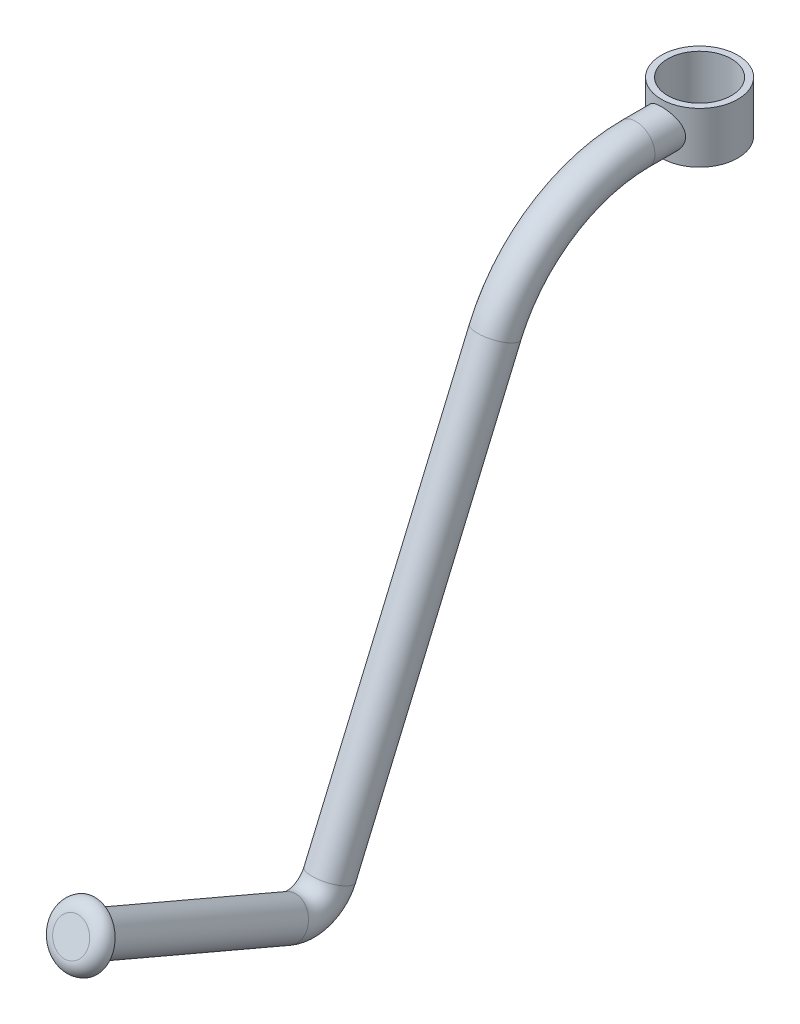
ISO-10303-21;
HEADER;
FILE_DESCRIPTION(('STEP AP214'),'2;1');
FILE_NAME('part.step','',(''),(''),'','','');
FILE_SCHEMA(('AUTOMOTIVE_DESIGN { 1 0 10303 214 1 1 1 1 }'));
ENDSEC;
DATA;
#1=APPLICATION_CONTEXT('core data for automotive mechanical design processes');
#2=APPLICATION_PROTOCOL_DEFINITION('international standard','automotive_design',2000,#1);
#3=PRODUCT_CONTEXT('',#1,'mechanical');
#4=PRODUCT('Part','Part','',(#3));
#5=PRODUCT_RELATED_PRODUCT_CATEGORY('part','',(#4));
#6=PRODUCT_DEFINITION_FORMATION('','',#4);
#7=PRODUCT_DEFINITION_CONTEXT('part definition',#1,'design');
#8=PRODUCT_DEFINITION('design','',#6,#7);
#9=PRODUCT_DEFINITION_SHAPE('','',#8);
#10=(LENGTH_UNIT() NAMED_UNIT(*) SI_UNIT(.MILLI.,.METRE.));
#11=(NAMED_UNIT(*) PLANE_ANGLE_UNIT() SI_UNIT($,.RADIAN.));
#12=(NAMED_UNIT(*) SI_UNIT($,.STERADIAN.) SOLID_ANGLE_UNIT());
#13=UNCERTAINTY_MEASURE_WITH_UNIT(LENGTH_MEASURE(1.E-05),#10,'distance_accuracy_value','');
#14=(GEOMETRIC_REPRESENTATION_CONTEXT(3) GLOBAL_UNCERTAINTY_ASSIGNED_CONTEXT((#13)) GLOBAL_UNIT_ASSIGNED_CONTEXT((#10,
#11,#12)) REPRESENTATION_CONTEXT('',''));
#15=CARTESIAN_POINT('',(0.,0.,0.));
#16=DIRECTION('',(0.,0.,1.));
#17=DIRECTION('',(1.,0.,0.));
#18=AXIS2_PLACEMENT_3D('',#15,#16,#17);
#19=CARTESIAN_POINT('',(0.,-198.214108787436,164.080363385463));
#20=DIRECTION('',(0.,0.392589859257044,0.919713652398688));
#21=DIRECTION('',(0.,-0.919713652398688,0.392589859257044));
#22=AXIS2_PLACEMENT_3D('',#19,#20,#21);
#23=CYLINDRICAL_SURFACE('',#22,7.62);
#24=CARTESIAN_POINT('',(0.,-198.214108787436,164.080363385463));
#25=DIRECTION('',(0.,0.392589859257048,0.919713652398686));
#26=DIRECTION('',(1.,0.,0.));
#27=AXIS2_PLACEMENT_3D('',#24,#25,#26);
#28=CIRCLE('',#27,7.62);
#29=CARTESIAN_POINT('',(0.,-205.222326818714,167.071898113002));
#30=VERTEX_POINT('',#29);
#31=EDGE_CURVE('E47',#30,#30,#28,.T.);
#32=ORIENTED_EDGE('',*,*,#31,.T.);
#33=EDGE_LOOP('',(#32));
#34=FACE_BOUND('',#33,.T.);
#35=CARTESIAN_POINT('',(0.,-163.312870299484,245.842907083707));
#36=DIRECTION('',(0.,0.392589859257048,0.919713652398686));
#37=DIRECTION('',(1.,0.,0.));
#38=AXIS2_PLACEMENT_3D('',#35,#36,#37);
#39=CIRCLE('',#38,7.62);
#40=CARTESIAN_POINT('',(7.62,-163.312870299484,245.842907083707));
#41=VERTEX_POINT('',#40);
#42=EDGE_CURVE('E43',#41,#41,#39,.T.);
#43=ORIENTED_EDGE('',*,*,#42,.F.);
#44=EDGE_LOOP('',(#43));
#45=FACE_BOUND('',#44,.T.);
#46=ADVANCED_FACE('F31',(#34,#45),#23,.T.);
#47=CARTESIAN_POINT('',(0.,-186.533745401972,159.094472172899));
#48=DIRECTION('',(-1.,0.,0.));
#49=DIRECTION('',(0.,0.,1.));
#50=AXIS2_PLACEMENT_3D('',#47,#48,#49);
#51=TOROIDAL_SURFACE('',#50,12.7,7.62);
#52=CARTESIAN_POINT('',(0.,-191.519636614537,147.414108787435));
#53=DIRECTION('',(0.,-0.919713652398692,0.392589859257035));
#54=DIRECTION('',(1.,0.,0.));
#55=AXIS2_PLACEMENT_3D('',#52,#53,#54);
#56=CIRCLE('',#55,7.62);
#57=CARTESIAN_POINT('',(0.,-194.511171342075,140.405890756157));
#58=VERTEX_POINT('',#57);
#59=EDGE_CURVE('E52',#58,#58,#56,.T.);
#60=CARTESIAN_POINT('',(0.,-186.533745401972,159.094472172899));
#61=DIRECTION('',(-1.,0.,0.));
#62=DIRECTION('',(0.,0.,1.));
#63=AXIS2_PLACEMENT_3D('',#60,#61,#62);
#64=CIRCLE('',#63,20.32);
#65=EDGE_CURVE('',#58,#30,#64,.T.);
#66=ORIENTED_EDGE('',*,*,#59,.T.);
#67=ORIENTED_EDGE('',*,*,#31,.F.);
#68=ORIENTED_EDGE('',*,*,#65,.T.);
#69=ORIENTED_EDGE('',*,*,#65,.F.);
#70=EDGE_LOOP('',(#66,#68,#67,#69));
#71=FACE_BOUND('',#70,.T.);
#72=ADVANCED_FACE('F110',(#71),#51,.T.);
#73=CARTESIAN_POINT('',(0.,-37.0277221796908,81.4675407592865));
#74=DIRECTION('',(0.,-0.919713652398688,0.392589859257044));
#75=DIRECTION('',(0.,-0.392589859257044,-0.919713652398688));
#76=AXIS2_PLACEMENT_3D('',#73,#74,#75);
#77=CYLINDRICAL_SURFACE('',#76,7.62);
#78=CARTESIAN_POINT('',(0.,-37.0277221796908,81.4675407592865));
#79=DIRECTION('',(0.,-0.919713652398692,0.392589859257035));
#80=DIRECTION('',(1.,0.,0.));
#81=AXIS2_PLACEMENT_3D('',#78,#79,#80);
#82=CIRCLE('',#81,7.62);
#83=CARTESIAN_POINT('',(0.,-34.0361874521522,88.4757587905645));
#84=VERTEX_POINT('',#83);
#85=EDGE_CURVE('E55',#84,#84,#82,.T.);
#86=ORIENTED_EDGE('',*,*,#85,.T.);
#87=EDGE_LOOP('',(#86));
#88=FACE_BOUND('',#87,.T.);
#89=ORIENTED_EDGE('',*,*,#59,.F.);
#90=EDGE_LOOP('',(#89));
#91=FACE_BOUND('',#90,.T.);
#92=ADVANCED_FACE('F104',(#88,#91),#77,.T.);
#93=CARTESIAN_POINT('',(0.,-60.96,25.4017965090624));
#94=DIRECTION('',(1.,0.,0.));
#95=DIRECTION('',(0.,0.,-1.));
#96=AXIS2_PLACEMENT_3D('',#93,#94,#95);
#97=TOROIDAL_SURFACE('',#96,60.96,7.62);
#98=CARTESIAN_POINT('',(0.,0.,25.4017965090621));
#99=DIRECTION('',(0.,0.,1.));
#100=DIRECTION('',(1.,0.,0.));
#101=AXIS2_PLACEMENT_3D('',#98,#99,#100);
#102=CIRCLE('',#101,7.62);
#103=CARTESIAN_POINT('',(0.,7.61999999999998,25.4017965090621));
#104=VERTEX_POINT('',#103);
#105=EDGE_CURVE('E58',#104,#104,#102,.T.);
#106=CARTESIAN_POINT('',(0.,-60.96,25.4017965090624));
#107=DIRECTION('',(1.,0.,0.));
#108=DIRECTION('',(0.,0.,-1.));
#109=AXIS2_PLACEMENT_3D('',#106,#107,#108);
#110=CIRCLE('',#109,68.58);
#111=EDGE_CURVE('',#104,#84,#110,.T.);
#112=ORIENTED_EDGE('',*,*,#105,.T.);
#113=ORIENTED_EDGE('',*,*,#85,.F.);
#114=ORIENTED_EDGE('',*,*,#111,.T.);
#115=ORIENTED_EDGE('',*,*,#111,.F.);
#116=EDGE_LOOP('',(#112,#114,#113,#115));
#117=FACE_BOUND('',#116,.T.);
#118=ADVANCED_FACE('F99',(#117),#97,.T.);
#119=CARTESIAN_POINT('',(0.,0.,25.4017965090621));
#120=DIRECTION('',(0.,0.,-1.));
#121=DIRECTION('',(0.,1.,0.));
#122=AXIS2_PLACEMENT_3D('',#119,#120,#121);
#123=CYLINDRICAL_SURFACE('',#122,7.62);
#124=CARTESIAN_POINT('',(0.,7.62,15.24));
#125=CARTESIAN_POINT('',(-0.200389052748765,7.61999933112047,15.2399993870959));
#126=CARTESIAN_POINT('',(-0.400792134860344,7.61208621116142,15.2360384094973));
#127=CARTESIAN_POINT('',(-0.800122237348405,7.58052398867701,15.220294342279));
#128=CARTESIAN_POINT('',(-0.999048577506729,7.55686804049495,15.208507849795));
#129=CARTESIAN_POINT('',(-1.39412955481112,7.49405547014642,15.1773951087737));
#130=CARTESIAN_POINT('',(-1.59027982482928,7.45487674513685,15.1580581096597));
#131=CARTESIAN_POINT('',(-1.97819217560704,7.36145234121303,15.1123301864553));
#132=CARTESIAN_POINT('',(-2.16995242620642,7.30720049794546,15.0859363765547));
#133=CARTESIAN_POINT('',(-2.54693148370567,7.1844732146036,15.0268749662046));
#134=CARTESIAN_POINT('',(-2.73217503314634,7.1160604201605,14.994235043955));
#135=CARTESIAN_POINT('',(-3.09592544609003,6.96551778803391,14.9233792467849));
#136=CARTESIAN_POINT('',(-3.27442987092417,6.88338304206239,14.8851613772752));
#137=CARTESIAN_POINT('',(-3.79814632635503,6.61751869730242,14.7634606755253));
#138=CARTESIAN_POINT('',(-4.13197354346543,6.41419340983094,14.6728633070388));
#139=CARTESIAN_POINT('',(-4.78170450788777,5.94721868215098,14.4746436372215));
#140=CARTESIAN_POINT('',(-5.09530212546499,5.68066393249043,14.3663229501182));
#141=CARTESIAN_POINT('',(-5.53017163590872,5.24630396238984,14.2020759738914));
#142=CARTESIAN_POINT('',(-5.66929408428559,5.09564206028488,14.1469924724645));
#143=CARTESIAN_POINT('',(-5.93512138954723,4.78338327132349,14.0375412561791));
#144=CARTESIAN_POINT('',(-6.06182417992948,4.6217845722334,13.9831736617386));
#145=CARTESIAN_POINT('',(-6.31142872443157,4.2754324079682,13.8724024312945));
#146=CARTESIAN_POINT('',(-6.43326575956811,4.08985581082619,13.8161700397446));
#147=CARTESIAN_POINT('',(-6.66071029233197,3.70792535867673,13.7079682965424));
#148=CARTESIAN_POINT('',(-6.76632458750593,3.51157606463826,13.6559971636445));
#149=CARTESIAN_POINT('',(-6.96040371555041,3.10918900485058,13.5581045155894));
#150=CARTESIAN_POINT('',(-7.04887378183934,2.90315421961706,13.5121811556753));
#151=CARTESIAN_POINT('',(-7.20771619980376,2.48268295756014,13.4281240039852));
#152=CARTESIAN_POINT('',(-7.27809055683153,2.26824741473973,13.3899893491675));
#153=CARTESIAN_POINT('',(-7.39616601084082,1.84562872623832,13.3251114526205));
#154=CARTESIAN_POINT('',(-7.44497094914367,1.63783803031548,13.2978235470201));
#155=CARTESIAN_POINT('',(-7.52507934036937,1.21789205681436,13.2526565679401));
#156=CARTESIAN_POINT('',(-7.55638354194646,1.00573696634067,13.2347770919843));
#157=CARTESIAN_POINT('',(-7.60098640450717,0.579108874467945,13.209211568945));
#158=CARTESIAN_POINT('',(-7.61430029521929,0.364637988764167,13.2015169000086));
#159=CARTESIAN_POINT('',(-7.62274929905469,-0.0647719122408087,13.1966406056522));
#160=CARTESIAN_POINT('',(-7.6178861465916,-0.279710880922684,13.1994579771962));
#161=CARTESIAN_POINT('',(-7.59174223884257,-0.682298489726915,13.2145082820566));
#162=CARTESIAN_POINT('',(-7.57250079287,-0.870127997729674,13.2255712555286));
#163=CARTESIAN_POINT('',(-7.52024525952807,-1.24330915513624,13.2553542685976));
#164=CARTESIAN_POINT('',(-7.48722662004449,-1.42865996464521,13.2740768389575));
#165=CARTESIAN_POINT('',(-7.40780402600324,-1.79557049429717,13.318562406801));
#166=CARTESIAN_POINT('',(-7.36140187547325,-1.97713072185605,13.3443244553751));
#167=CARTESIAN_POINT('',(-7.25567247976937,-2.33549461565463,13.4021059101251));
#168=CARTESIAN_POINT('',(-7.19634007615627,-2.51229635180781,13.4341278131022));
#169=CARTESIAN_POINT('',(-7.06379938654427,-2.86413747130402,13.5042987405095));
#170=CARTESIAN_POINT('',(-6.99030499600682,-3.03904425560982,13.5425710584165));
#171=CARTESIAN_POINT('',(-6.830933600302,-3.38208988647266,13.6236536271176));
#172=CARTESIAN_POINT('',(-6.74505248132593,-3.5502264607218,13.666465384268));
#173=CARTESIAN_POINT('',(-6.56149005612769,-3.87900806921128,13.7555390228931));
#174=CARTESIAN_POINT('',(-6.46380663323824,-4.03965175246813,13.8018015226652));
#175=CARTESIAN_POINT('',(-6.25720526658594,-4.35281250096396,13.8966868159725));
#176=CARTESIAN_POINT('',(-6.14828663762938,-4.50532906969898,13.9453097533661));
#177=CARTESIAN_POINT('',(-5.90523172616462,-4.82048768785209,14.0501067103081));
#178=CARTESIAN_POINT('',(-5.76964929979113,-4.98195867299241,14.1064559706928));
#179=CARTESIAN_POINT('',(-5.48561187112197,-5.29309344244474,14.2193184401759));
#180=CARTESIAN_POINT('',(-5.33715628865858,-5.4427566940244,14.2758316565524));
#181=CARTESIAN_POINT('',(-5.02803156745268,-5.72955196235147,14.3876168592761));
#182=CARTESIAN_POINT('',(-4.86735734124845,-5.86667870637746,14.4428883160479));
#183=CARTESIAN_POINT('',(-4.53459728134255,-6.12752194541407,14.5507946041257));
#184=CARTESIAN_POINT('',(-4.36250995996062,-6.25123668663061,14.6034290901305));
#185=CARTESIAN_POINT('',(-3.99948426078763,-6.48982883404093,14.7071070041754));
#186=CARTESIAN_POINT('',(-3.80804060183953,-6.6040219537614,14.7579607733878));
#187=CARTESIAN_POINT('',(-3.4148253343613,-6.815657911358,14.853871450971));
#188=CARTESIAN_POINT('',(-3.21305842226311,-6.91310827972924,14.8989309631559));
#189=CARTESIAN_POINT('',(-2.80054831696709,-7.09025324598383,14.9819481081978));
#190=CARTESIAN_POINT('',(-2.58980864927066,-7.16995474230321,15.0199084993405));
#191=CARTESIAN_POINT('',(-2.16089684932038,-7.31066669703327,15.0875855390376));
#192=CARTESIAN_POINT('',(-1.94272557529087,-7.37167930561617,15.1173031358951));
#193=CARTESIAN_POINT('',(-1.51912382699792,-7.4699361853961,15.1654697830678));
#194=CARTESIAN_POINT('',(-1.31413497828668,-7.50873065901328,15.1846483514069));
#195=CARTESIAN_POINT('',(-0.901069528719807,-7.56941475059056,15.214747514195));
#196=CARTESIAN_POINT('',(-0.692993096443349,-7.5913052880536,15.2256685578178));
#197=CARTESIAN_POINT('',(-0.275555548078839,-7.6178864567501,15.2389389981102));
#198=CARTESIAN_POINT('',(-0.066194979200472,-7.62258396496374,15.2412918219505));
#199=CARTESIAN_POINT('',(0.352116612757106,-7.61473367364828,15.2373670858838));
#200=CARTESIAN_POINT('',(0.561067653551294,-7.60218663732586,15.2310899079222));
#201=CARTESIAN_POINT('',(0.960611443175968,-7.56166364141736,15.2109066109367));
#202=CARTESIAN_POINT('',(1.15136746435125,-7.53496431099464,15.197632173613));
#203=CARTESIAN_POINT('',(1.52979408087136,-7.46733460522517,15.1642151478419));
#204=CARTESIAN_POINT('',(1.71746360605785,-7.42639939855544,15.1440702277583));
#205=CARTESIAN_POINT('',(2.08836932228737,-7.33074245639878,15.0973919679317));
#206=CARTESIAN_POINT('',(2.2716069135528,-7.27602513926776,15.0708606756928));
#207=CARTESIAN_POINT('',(2.63268684085881,-7.15330273075568,15.0119966151702));
#208=CARTESIAN_POINT('',(2.81052704592727,-7.08529246797123,14.97966158944));
#209=CARTESIAN_POINT('',(3.16471027486104,-6.93448524722995,14.9089142135842));
#210=CARTESIAN_POINT('',(3.34086986820472,-6.85132559388337,14.8703562766198));
#211=CARTESIAN_POINT('',(3.68552108055829,-6.67226232710859,14.788710301237));
#212=CARTESIAN_POINT('',(3.85401007413711,-6.57635439367766,14.7456207282236));
#213=CARTESIAN_POINT('',(4.34672851734763,-6.27054106358215,14.6109289550652));
#214=CARTESIAN_POINT('',(4.65839448154239,-6.04246670545763,14.5138652499375));
#215=CARTESIAN_POINT('',(5.27135992981212,-5.51863218699559,14.3033399379658));
#216=CARTESIAN_POINT('',(5.56863588446484,-5.21842463382493,14.1892040684354));
#217=CARTESIAN_POINT('',(5.97470874527959,-4.73410789218589,14.0207727373369));
#218=CARTESIAN_POINT('',(6.10350456304907,-4.56686867385385,13.9650519075221));
#219=CARTESIAN_POINT('',(6.34715890653714,-4.22167950876311,13.8560080859459));
#220=CARTESIAN_POINT('',(6.46201534703345,-4.04372796546589,13.8026854536853));
#221=CARTESIAN_POINT('',(6.68219266890034,-3.66908627935128,13.6975005647349));
#222=CARTESIAN_POINT('',(6.78677459524592,-3.47190546746124,13.6458365898694));
#223=CARTESIAN_POINT('',(6.97868291236006,-3.06795535899799,13.5486955739976));
#224=CARTESIAN_POINT('',(7.06601762077949,-2.8611907440097,13.5032155540272));
#225=CARTESIAN_POINT('',(7.22244711917178,-2.43950500421135,13.4201975906997));
#226=CARTESIAN_POINT('',(7.2915565506822,-2.22459058641539,13.3826532769224));
#227=CARTESIAN_POINT('',(7.41067925844458,-1.78812198988992,13.3170594972143));
#228=CARTESIAN_POINT('',(7.46069549143942,-1.56656884495901,13.2890085612302));
#229=CARTESIAN_POINT('',(7.53699964640157,-1.14031410490259,13.2458658739041));
#230=CARTESIAN_POINT('',(7.56510443772073,-0.936036414938812,13.2297886112909));
#231=CARTESIAN_POINT('',(7.60466621412025,-0.52535277761331,13.2070882537434));
#232=CARTESIAN_POINT('',(7.61612433138626,-0.31894697595197,13.2004645158496));
#233=CARTESIAN_POINT('',(7.62221716753531,0.0941173395051916,13.1969472580895));
#234=CARTESIAN_POINT('',(7.61685810893701,0.300775731554316,13.2000501392791));
#235=CARTESIAN_POINT('',(7.58941254829923,0.712601147622057,13.2158491018893));
#236=CARTESIAN_POINT('',(7.56732673104572,0.917768232346975,13.2285447905846));
#237=CARTESIAN_POINT('',(7.50966030428848,1.30539310216768,13.26135661259));
#238=CARTESIAN_POINT('',(7.47557231883686,1.48814617396972,13.2806469475903));
#239=CARTESIAN_POINT('',(7.3943587897948,1.84992944345013,13.326035461795));
#240=CARTESIAN_POINT('',(7.34722891745361,2.02895838379757,13.3521359011862));
#241=CARTESIAN_POINT('',(7.24041616627968,2.38218782904487,13.4103567129976));
#242=CARTESIAN_POINT('',(7.18073496398133,2.55638897529997,13.4424762813548));
#243=CARTESIAN_POINT('',(7.04931251393741,2.89919062583854,13.5118582267889));
#244=CARTESIAN_POINT('',(6.97756659499265,3.06778893042487,13.5491225948177));
#245=CARTESIAN_POINT('',(6.81738273848645,3.40964279829176,13.6304617689873));
#246=CARTESIAN_POINT('',(6.72814990699654,3.58245710366089,13.6748252336024));
#247=CARTESIAN_POINT('',(6.53718849234896,3.92010227021026,13.7671352858568));
#248=CARTESIAN_POINT('',(6.43545566843469,4.08493039540284,13.8150830873484));
#249=CARTESIAN_POINT('',(6.2200926876661,4.40592914943705,13.913376945737));
#250=CARTESIAN_POINT('',(6.10645940426382,4.5620974865702,13.9637236309774));
#251=CARTESIAN_POINT('',(5.86788865259492,4.86512843699069,14.0656429086842));
#252=CARTESIAN_POINT('',(5.74295040886165,5.01199041072899,14.1172155850686));
#253=CARTESIAN_POINT('',(5.46643751516568,5.31311357763389,14.2267487130088));
#254=CARTESIAN_POINT('',(5.31347214461883,5.46609648033354,14.2847219321866));
#255=CARTESIAN_POINT('',(4.9948485915201,5.75870301025952,14.3992269522379));
#256=CARTESIAN_POINT('',(4.82919412662364,5.89833052359779,14.4557591688765));
#257=CARTESIAN_POINT('',(4.48580919248001,6.16352311507122,14.5659760167596));
#258=CARTESIAN_POINT('',(4.30806705058995,6.2890742812726,14.6196578037683));
#259=CARTESIAN_POINT('',(3.94167087040276,6.52495803678374,14.7226703971062));
#260=CARTESIAN_POINT('',(3.75302185746732,6.63529755681283,14.7720031812062));
#261=CARTESIAN_POINT('',(3.36433743667835,6.84063652651191,14.8653651043243));
#262=CARTESIAN_POINT('',(3.16422574290582,6.93551172582263,14.9093506263013));
#263=CARTESIAN_POINT('',(2.75537191154598,7.10784840020684,14.9902942483844));
#264=CARTESIAN_POINT('',(2.54663407382198,7.18531843015817,15.0272557994846));
#265=CARTESIAN_POINT('',(2.12247064606241,7.32181985948673,15.0930008618309));
#266=CARTESIAN_POINT('',(1.9070607901164,7.38089147445723,15.1218021971915));
#267=CARTESIAN_POINT('',(1.47102058624612,7.48000238354872,15.1704239717375));
#268=CARTESIAN_POINT('',(1.25039351402723,7.52005330361487,15.1902498965805));
#269=CARTESIAN_POINT('',(0.858075645734713,7.5734790635067,15.2167800809676));
#270=CARTESIAN_POINT('',(0.687058578509208,7.5909094796262,15.2254723231619));
#271=CARTESIAN_POINT('',(0.344031138498728,7.61417039505456,15.2370826254348));
#272=CARTESIAN_POINT('',(0.172020738428486,7.6200005741888,15.2400005261376));
#273=CARTESIAN_POINT('',(0.,7.62,15.24));
#274=B_SPLINE_CURVE_WITH_KNOTS('',3,(#124,#125,#126,#127,#128,#129,#130,#131,#132,#133,#134,
#135,#136,#137,#138,#139,#140,#141,#142,#143,#144,#145,#146,#147,#148,#149,#150,#151,#152,#153,
#154,#155,#156,#157,#158,#159,#160,#161,#162,#163,#164,#165,#166,#167,#168,#169,#170,#171,#172,
#173,#174,#175,#176,#177,#178,#179,#180,#181,#182,#183,#184,#185,#186,#187,#188,#189,#190,#191,
#192,#193,#194,#195,#196,#197,#198,#199,#200,#201,#202,#203,#204,#205,#206,#207,#208,#209,#210,
#211,#212,#213,#214,#215,#216,#217,#218,#219,#220,#221,#222,#223,#224,#225,#226,#227,#228,#229,
#230,#231,#232,#233,#234,#235,#236,#237,#238,#239,#240,#241,#242,#243,#244,#245,#246,#247,#248,
#249,#250,#251,#252,#253,#254,#255,#256,#257,#258,#259,#260,#261,#262,#263,#264,#265,#266,#267,
#268,#269,#270,#271,#272,#273),.UNSPECIFIED.,.T.,.F.,(4,2,2,2,2,2,2,2,2,2,2,2,2,2,2,2,2,2,2,2,2,
2,2,2,2,2,2,2,2,2,2,2,2,2,2,2,2,2,2,2,2,2,2,2,2,2,2,2,2,2,2,2,2,2,2,2,2,2,2,2,2,2,2,2,2,2,2,2,2,
2,2,2,2,2,4),(0.,0.600997469046432,1.20225644847363,1.80437465372387,2.40673946665128,
3.00649438805522,3.60646430056188,4.80510253134211,6.0762556771424,6.71274689487066,
7.34934383901367,8.03552448558677,8.72141682426202,9.40709945763917,10.0927060714253,
10.7373306295671,11.3819276095645,12.0259785622943,12.6699680626628,13.2367093083237,
13.8036379590866,14.3704902265013,14.9375690512238,15.5176066129482,16.0978372588837,
16.6781721203489,17.2585423952419,17.9125600424612,18.5666071802978,19.2209281498935,
19.8753345775391,20.5603587065329,21.2450739165975,21.9295225328094,22.6138923730308,
23.2415725087266,23.8692184988612,24.4966134115986,25.1239805580724,25.7025272167684,
26.2812704125682,26.8598283068472,27.4386117292383,28.0337060141898,28.6290024749868,
29.8189869926844,31.125829176745,31.7801935631141,32.4346557169566,33.1210586529196,
33.8071297511648,34.4926479936495,35.1780600347442,35.7976773189765,36.4172524593762,
37.0365983779816,37.6559189422147,38.2160089830353,38.7762851475559,39.3364865210909,
39.8969052940823,40.4947611919914,41.0928204818875,41.6910372929577,42.2892951700166,
42.9604373571782,43.6313836594588,44.3029873322856,44.974283991038,45.6507334704099,
46.3268497347051,47.0014775882788,47.6756925592974,48.1915948685703,48.7075114169091),.UNSPECIFIED.);
#275=CARTESIAN_POINT('',(0.,7.62,15.24));
#276=VERTEX_POINT('',#275);
#277=EDGE_CURVE('E35',#276,#276,#274,.T.);
#278=ORIENTED_EDGE('',*,*,#277,.T.);
#279=EDGE_LOOP('',(#278));
#280=FACE_BOUND('',#279,.T.);
#281=ORIENTED_EDGE('',*,*,#105,.F.);
#282=EDGE_LOOP('',(#281));
#283=FACE_BOUND('',#282,.T.);
#284=ADVANCED_FACE('F95',(#280,#283),#123,.T.);
#285=CARTESIAN_POINT('',(0.,-161.318513814459,250.515052437892));
#286=DIRECTION('',(0.,0.392589859257048,0.919713652398686));
#287=DIRECTION('',(0.,-0.919713652398686,0.392589859257048));
#288=AXIS2_PLACEMENT_3D('',#285,#286,#287);
#289=PLANE('',#288);
#290=CARTESIAN_POINT('',(0.,-161.318513814459,250.515052437892));
#291=DIRECTION('',(0.,0.392589859257048,0.919713652398686));
#292=DIRECTION('',(0.,-0.919713652398686,0.392589859257048));
#293=AXIS2_PLACEMENT_3D('',#290,#291,#292);
#294=CIRCLE('',#293,6.87033042694305);
#295=CARTESIAN_POINT('',(0.,-167.637250504608,253.212274493255));
#296=VERTEX_POINT('',#295);
#297=EDGE_CURVE('E10',#296,#296,#294,.T.);
#298=ORIENTED_EDGE('',*,*,#297,.T.);
#299=EDGE_LOOP('',(#298));
#300=FACE_BOUND('',#299,.T.);
#301=ADVANCED_FACE('F98',(#300),#289,.T.);
#302=CARTESIAN_POINT('',(0.,-163.312870299484,245.842907083707));
#303=DIRECTION('',(0.,0.392589859257048,0.919713652398686));
#304=DIRECTION('',(0.,-0.919713652398686,0.392589859257048));
#305=AXIS2_PLACEMENT_3D('',#302,#303,#304);
#306=PLANE('',#305);
#307=ORIENTED_EDGE('',*,*,#42,.T.);
#308=EDGE_LOOP('',(#307));
#309=FACE_BOUND('',#308,.T.);
#310=CARTESIAN_POINT('',(0.,-163.312870299484,245.842907083707));
#311=DIRECTION('',(0.,0.392589859257048,0.919713652398686));
#312=DIRECTION('',(0.,-0.919713652398686,0.392589859257048));
#313=AXIS2_PLACEMENT_3D('',#310,#311,#312);
#314=CIRCLE('',#313,11.950330426943);
#315=CARTESIAN_POINT('',(0.,-174.303752343819,250.534485624095));
#316=VERTEX_POINT('',#315);
#317=EDGE_CURVE('E61',#316,#316,#314,.T.);
#318=ORIENTED_EDGE('',*,*,#317,.F.);
#319=EDGE_LOOP('',(#318));
#320=FACE_BOUND('',#319,.T.);
#321=ADVANCED_FACE('F123',(#309,#320),#306,.F.);
#322=CARTESIAN_POINT('',(0.,-163.312870299484,245.842907083707));
#323=DIRECTION('',(0.,0.392589859257048,0.919713652398686));
#324=DIRECTION('',(0.,-0.919713652398686,0.392589859257048));
#325=AXIS2_PLACEMENT_3D('',#322,#323,#324);
#326=TOROIDAL_SURFACE('',#325,6.87033042694305,5.08);
#327=ORIENTED_EDGE('',*,*,#317,.T.);
#328=EDGE_LOOP('',(#327));
#329=FACE_BOUND('',#328,.T.);
#330=ORIENTED_EDGE('',*,*,#297,.F.);
#331=EDGE_LOOP('',(#330));
#332=FACE_BOUND('',#331,.T.);
#333=ADVANCED_FACE('F33',(#329,#332),#326,.T.);
#334=CARTESIAN_POINT('',(0.,-10.16,0.));
#335=DIRECTION('',(0.,1.,0.));
#336=DIRECTION('',(0.,0.,1.));
#337=AXIS2_PLACEMENT_3D('',#334,#335,#336);
#338=CYLINDRICAL_SURFACE('',#337,15.24);
#339=CARTESIAN_POINT('',(0.,10.16,0.));
#340=DIRECTION('',(0.,1.,0.));
#341=DIRECTION('',(0.,0.,1.));
#342=AXIS2_PLACEMENT_3D('',#339,#340,#341);
#343=CIRCLE('',#342,15.24);
#344=CARTESIAN_POINT('',(0.,10.16,15.24));
#345=VERTEX_POINT('',#344);
#346=EDGE_CURVE('E67',#345,#345,#343,.T.);
#347=ORIENTED_EDGE('',*,*,#346,.F.);
#348=EDGE_LOOP('',(#347));
#349=FACE_BOUND('',#348,.T.);
#350=CARTESIAN_POINT('',(0.,-10.16,0.));
#351=DIRECTION('',(0.,1.,0.));
#352=DIRECTION('',(0.,0.,1.));
#353=AXIS2_PLACEMENT_3D('',#350,#351,#352);
#354=CIRCLE('',#353,15.24);
#355=CARTESIAN_POINT('',(0.,-10.16,15.24));
#356=VERTEX_POINT('',#355);
#357=EDGE_CURVE('E64',#356,#356,#354,.T.);
#358=ORIENTED_EDGE('',*,*,#357,.T.);
#359=EDGE_LOOP('',(#358));
#360=FACE_BOUND('',#359,.T.);
#361=ORIENTED_EDGE('',*,*,#277,.F.);
#362=EDGE_LOOP('',(#361));
#363=FACE_BOUND('',#362,.T.);
#364=ADVANCED_FACE('F87',(#349,#360,#363),#338,.T.);
#365=CARTESIAN_POINT('',(0.,-10.16,0.));
#366=DIRECTION('',(0.,1.,0.));
#367=DIRECTION('',(0.,0.,1.));
#368=AXIS2_PLACEMENT_3D('',#365,#366,#367);
#369=PLANE('',#368);
#370=CARTESIAN_POINT('',(0.,-10.16,0.));
#371=DIRECTION('',(0.,1.,0.));
#372=DIRECTION('',(0.,0.,1.));
#373=AXIS2_PLACEMENT_3D('',#370,#371,#372);
#374=CIRCLE('',#373,12.7);
#375=CARTESIAN_POINT('',(0.,-10.16,12.7));
#376=VERTEX_POINT('',#375);
#377=EDGE_CURVE('E70',#376,#376,#374,.T.);
#378=ORIENTED_EDGE('',*,*,#377,.T.);
#379=EDGE_LOOP('',(#378));
#380=FACE_BOUND('',#379,.T.);
#381=ORIENTED_EDGE('',*,*,#357,.F.);
#382=EDGE_LOOP('',(#381));
#383=FACE_BOUND('',#382,.T.);
#384=ADVANCED_FACE('F83',(#380,#383),#369,.F.);
#385=CARTESIAN_POINT('',(0.,10.16,0.));
#386=DIRECTION('',(0.,1.,0.));
#387=DIRECTION('',(0.,0.,1.));
#388=AXIS2_PLACEMENT_3D('',#385,#386,#387);
#389=PLANE('',#388);
#390=CARTESIAN_POINT('',(0.,10.16,0.));
#391=DIRECTION('',(0.,1.,0.));
#392=DIRECTION('',(0.,0.,1.));
#393=AXIS2_PLACEMENT_3D('',#390,#391,#392);
#394=CIRCLE('',#393,12.7);
#395=CARTESIAN_POINT('',(0.,10.16,12.7));
#396=VERTEX_POINT('',#395);
#397=EDGE_CURVE('E73',#396,#396,#394,.T.);
#398=ORIENTED_EDGE('',*,*,#397,.F.);
#399=EDGE_LOOP('',(#398));
#400=FACE_BOUND('',#399,.T.);
#401=ORIENTED_EDGE('',*,*,#346,.T.);
#402=EDGE_LOOP('',(#401));
#403=FACE_BOUND('',#402,.T.);
#404=ADVANCED_FACE('F80',(#400,#403),#389,.T.);
#405=CARTESIAN_POINT('',(0.,-206.853745401972,0.));
#406=DIRECTION('',(0.,1.,0.));
#407=DIRECTION('',(0.,0.,1.));
#408=AXIS2_PLACEMENT_3D('',#405,#406,#407);
#409=CYLINDRICAL_SURFACE('',#408,12.7);
#410=ORIENTED_EDGE('',*,*,#397,.T.);
#411=EDGE_LOOP('',(#410));
#412=FACE_BOUND('',#411,.T.);
#413=ORIENTED_EDGE('',*,*,#377,.F.);
#414=EDGE_LOOP('',(#413));
#415=FACE_BOUND('',#414,.T.);
#416=ADVANCED_FACE('F77',(#412,#415),#409,.F.);
#417=CLOSED_SHELL('',(#46,#72,#92,#118,#284,#301,#321,#333,#364,#384,#404,#416));
#418=MANIFOLD_SOLID_BREP('B2',#417);
#419=ADVANCED_BREP_SHAPE_REPRESENTATION('',(#18,#418),#14);
#420=SHAPE_DEFINITION_REPRESENTATION(#9,#419);
ENDSEC;
END-ISO-10303-21;
